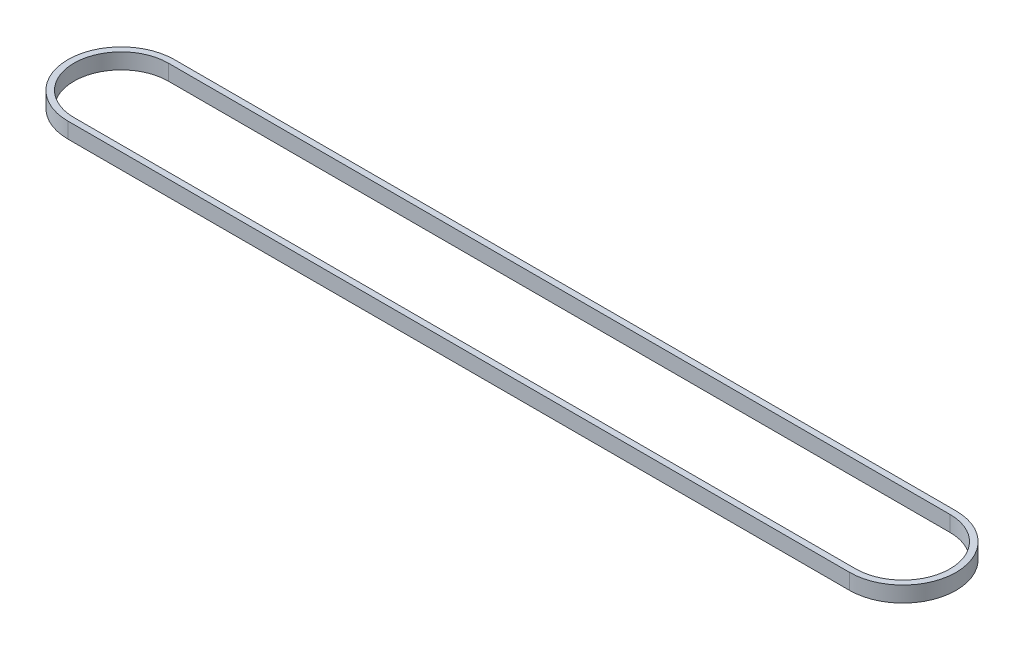
ISO-10303-21;
HEADER;
FILE_DESCRIPTION(('STEP AP214'),'2;1');
FILE_NAME('part.step','',(''),(''),'','','');
FILE_SCHEMA(('AUTOMOTIVE_DESIGN { 1 0 10303 214 1 1 1 1 }'));
ENDSEC;
DATA;
#1=APPLICATION_CONTEXT('core data for automotive mechanical design processes');
#2=APPLICATION_PROTOCOL_DEFINITION('international standard','automotive_design',2000,#1);
#3=PRODUCT_CONTEXT('',#1,'mechanical');
#4=PRODUCT('Part','Part','',(#3));
#5=PRODUCT_RELATED_PRODUCT_CATEGORY('part','',(#4));
#6=PRODUCT_DEFINITION_FORMATION('','',#4);
#7=PRODUCT_DEFINITION_CONTEXT('part definition',#1,'design');
#8=PRODUCT_DEFINITION('design','',#6,#7);
#9=PRODUCT_DEFINITION_SHAPE('','',#8);
#10=(LENGTH_UNIT() NAMED_UNIT(*) SI_UNIT(.MILLI.,.METRE.));
#11=(NAMED_UNIT(*) PLANE_ANGLE_UNIT() SI_UNIT($,.RADIAN.));
#12=(NAMED_UNIT(*) SI_UNIT($,.STERADIAN.) SOLID_ANGLE_UNIT());
#13=UNCERTAINTY_MEASURE_WITH_UNIT(LENGTH_MEASURE(1.E-05),#10,'distance_accuracy_value','');
#14=(GEOMETRIC_REPRESENTATION_CONTEXT(3) GLOBAL_UNCERTAINTY_ASSIGNED_CONTEXT((#13)) GLOBAL_UNIT_ASSIGNED_CONTEXT((#10,
#11,#12)) REPRESENTATION_CONTEXT('',''));
#15=CARTESIAN_POINT('',(0.,0.,0.));
#16=DIRECTION('',(0.,0.,1.));
#17=DIRECTION('',(1.,0.,0.));
#18=AXIS2_PLACEMENT_3D('',#15,#16,#17);
#19=CARTESIAN_POINT('',(0.,9.,-30.65));
#20=DIRECTION('',(0.,0.,-1.));
#21=DIRECTION('',(-1.,0.,0.));
#22=AXIS2_PLACEMENT_3D('',#19,#20,#21);
#23=PLANE('',#22);
#24=DIRECTION('',(1.,0.,0.));
#25=VECTOR('',#24,1.);
#26=CARTESIAN_POINT('',(0.,0.,-30.65));
#27=LINE('',#26,#25);
#28=CARTESIAN_POINT('',(0.,0.,-30.65));
#29=VERTEX_POINT('',#28);
#30=CARTESIAN_POINT('',(450.,0.,-30.65));
#31=VERTEX_POINT('',#30);
#32=EDGE_CURVE('E155',#29,#31,#27,.T.);
#33=ORIENTED_EDGE('',*,*,#32,.F.);
#34=DIRECTION('',(0.,-1.,0.));
#35=VECTOR('',#34,1.);
#36=CARTESIAN_POINT('',(0.,9.,-30.65));
#37=LINE('',#36,#35);
#38=CARTESIAN_POINT('',(0.,9.,-30.65));
#39=VERTEX_POINT('',#38);
#40=EDGE_CURVE('E11',#39,#29,#37,.T.);
#41=ORIENTED_EDGE('',*,*,#40,.F.);
#42=DIRECTION('',(1.,0.,0.));
#43=VECTOR('',#42,1.);
#44=CARTESIAN_POINT('',(0.,9.,-30.65));
#45=LINE('',#44,#43);
#46=CARTESIAN_POINT('',(450.,9.,-30.65));
#47=VERTEX_POINT('',#46);
#48=EDGE_CURVE('E128',#39,#47,#45,.T.);
#49=ORIENTED_EDGE('',*,*,#48,.T.);
#50=DIRECTION('',(0.,-1.,0.));
#51=VECTOR('',#50,1.);
#52=CARTESIAN_POINT('',(450.,9.,-30.65));
#53=LINE('',#52,#51);
#54=EDGE_CURVE('E94',#47,#31,#53,.T.);
#55=ORIENTED_EDGE('',*,*,#54,.T.);
#56=EDGE_LOOP('',(#33,#41,#49,#55));
#57=FACE_BOUND('',#56,.T.);
#58=ADVANCED_FACE('F41',(#57),#23,.T.);
#59=CARTESIAN_POINT('',(0.,9.,0.));
#60=DIRECTION('',(0.,-1.,0.));
#61=DIRECTION('',(0.,0.,-1.));
#62=AXIS2_PLACEMENT_3D('',#59,#60,#61);
#63=CYLINDRICAL_SURFACE('',#62,30.65);
#64=CARTESIAN_POINT('',(0.,0.,0.));
#65=DIRECTION('',(0.,1.,0.));
#66=DIRECTION('',(0.,0.,1.));
#67=AXIS2_PLACEMENT_3D('',#64,#65,#66);
#68=CIRCLE('',#67,30.65);
#69=CARTESIAN_POINT('',(0.,0.,30.65));
#70=VERTEX_POINT('',#69);
#71=EDGE_CURVE('E133',#29,#70,#68,.T.);
#72=ORIENTED_EDGE('',*,*,#71,.T.);
#73=DIRECTION('',(0.,-1.,0.));
#74=VECTOR('',#73,1.);
#75=CARTESIAN_POINT('',(0.,9.,30.65));
#76=LINE('',#75,#74);
#77=CARTESIAN_POINT('',(0.,9.,30.65));
#78=VERTEX_POINT('',#77);
#79=EDGE_CURVE('E51',#78,#70,#76,.T.);
#80=ORIENTED_EDGE('',*,*,#79,.F.);
#81=CARTESIAN_POINT('',(0.,9.,0.));
#82=DIRECTION('',(0.,1.,0.));
#83=DIRECTION('',(0.,0.,1.));
#84=AXIS2_PLACEMENT_3D('',#81,#82,#83);
#85=CIRCLE('',#84,30.65);
#86=EDGE_CURVE('E124',#39,#78,#85,.T.);
#87=ORIENTED_EDGE('',*,*,#86,.F.);
#88=ORIENTED_EDGE('',*,*,#40,.T.);
#89=EDGE_LOOP('',(#72,#80,#87,#88));
#90=FACE_BOUND('',#89,.T.);
#91=ADVANCED_FACE('F131',(#90),#63,.T.);
#92=CARTESIAN_POINT('',(0.,9.,30.65));
#93=DIRECTION('',(0.,0.,-1.));
#94=DIRECTION('',(-1.,0.,0.));
#95=AXIS2_PLACEMENT_3D('',#92,#93,#94);
#96=PLANE('',#95);
#97=DIRECTION('',(1.,0.,0.));
#98=VECTOR('',#97,1.);
#99=CARTESIAN_POINT('',(0.,0.,30.65));
#100=LINE('',#99,#98);
#101=CARTESIAN_POINT('',(450.,0.,30.6499999999999));
#102=VERTEX_POINT('',#101);
#103=EDGE_CURVE('E152',#70,#102,#100,.T.);
#104=ORIENTED_EDGE('',*,*,#103,.T.);
#105=DIRECTION('',(0.,-1.,0.));
#106=VECTOR('',#105,1.);
#107=CARTESIAN_POINT('',(450.,9.,30.6499999999999));
#108=LINE('',#107,#106);
#109=CARTESIAN_POINT('',(450.,9.,30.6499999999999));
#110=VERTEX_POINT('',#109);
#111=EDGE_CURVE('E123',#110,#102,#108,.T.);
#112=ORIENTED_EDGE('',*,*,#111,.F.);
#113=DIRECTION('',(1.,0.,0.));
#114=VECTOR('',#113,1.);
#115=CARTESIAN_POINT('',(0.,9.,30.65));
#116=LINE('',#115,#114);
#117=EDGE_CURVE('E117',#78,#110,#116,.T.);
#118=ORIENTED_EDGE('',*,*,#117,.F.);
#119=ORIENTED_EDGE('',*,*,#79,.T.);
#120=EDGE_LOOP('',(#104,#112,#118,#119));
#121=FACE_BOUND('',#120,.T.);
#122=ADVANCED_FACE('F120',(#121),#96,.F.);
#123=CARTESIAN_POINT('',(0.,9.,0.));
#124=DIRECTION('',(0.,-1.,0.));
#125=DIRECTION('',(0.,0.,-1.));
#126=AXIS2_PLACEMENT_3D('',#123,#124,#125);
#127=CYLINDRICAL_SURFACE('',#126,27.15);
#128=CARTESIAN_POINT('',(0.,0.,0.));
#129=DIRECTION('',(0.,1.,0.));
#130=DIRECTION('',(0.,0.,1.));
#131=AXIS2_PLACEMENT_3D('',#128,#129,#130);
#132=CIRCLE('',#131,27.15);
#133=CARTESIAN_POINT('',(0.,0.,-27.15));
#134=VERTEX_POINT('',#133);
#135=CARTESIAN_POINT('',(0.,0.,27.15));
#136=VERTEX_POINT('',#135);
#137=EDGE_CURVE('E165',#134,#136,#132,.T.);
#138=ORIENTED_EDGE('',*,*,#137,.F.);
#139=DIRECTION('',(0.,-1.,0.));
#140=VECTOR('',#139,1.);
#141=CARTESIAN_POINT('',(0.,9.,-27.15));
#142=LINE('',#141,#140);
#143=CARTESIAN_POINT('',(0.,9.,-27.15));
#144=VERTEX_POINT('',#143);
#145=EDGE_CURVE('E45',#144,#134,#142,.T.);
#146=ORIENTED_EDGE('',*,*,#145,.F.);
#147=CARTESIAN_POINT('',(0.,9.,0.));
#148=DIRECTION('',(0.,1.,0.));
#149=DIRECTION('',(0.,0.,1.));
#150=AXIS2_PLACEMENT_3D('',#147,#148,#149);
#151=CIRCLE('',#150,27.15);
#152=CARTESIAN_POINT('',(0.,9.,27.15));
#153=VERTEX_POINT('',#152);
#154=EDGE_CURVE('E151',#144,#153,#151,.T.);
#155=ORIENTED_EDGE('',*,*,#154,.T.);
#156=DIRECTION('',(0.,-1.,0.));
#157=VECTOR('',#156,1.);
#158=CARTESIAN_POINT('',(0.,9.,27.15));
#159=LINE('',#158,#157);
#160=EDGE_CURVE('E138',#153,#136,#159,.T.);
#161=ORIENTED_EDGE('',*,*,#160,.T.);
#162=EDGE_LOOP('',(#138,#146,#155,#161));
#163=FACE_BOUND('',#162,.T.);
#164=ADVANCED_FACE('F43',(#163),#127,.F.);
#165=CARTESIAN_POINT('',(0.,9.,-27.15));
#166=DIRECTION('',(0.,0.,-1.));
#167=DIRECTION('',(-1.,0.,0.));
#168=AXIS2_PLACEMENT_3D('',#165,#166,#167);
#169=PLANE('',#168);
#170=DIRECTION('',(1.,0.,0.));
#171=VECTOR('',#170,1.);
#172=CARTESIAN_POINT('',(0.,0.,-27.15));
#173=LINE('',#172,#171);
#174=CARTESIAN_POINT('',(450.,0.,-27.15));
#175=VERTEX_POINT('',#174);
#176=EDGE_CURVE('E163',#134,#175,#173,.T.);
#177=ORIENTED_EDGE('',*,*,#176,.T.);
#178=DIRECTION('',(0.,-1.,0.));
#179=VECTOR('',#178,1.);
#180=CARTESIAN_POINT('',(450.,9.,-27.15));
#181=LINE('',#180,#179);
#182=CARTESIAN_POINT('',(450.,9.,-27.15));
#183=VERTEX_POINT('',#182);
#184=EDGE_CURVE('E141',#183,#175,#181,.T.);
#185=ORIENTED_EDGE('',*,*,#184,.F.);
#186=DIRECTION('',(1.,0.,0.));
#187=VECTOR('',#186,1.);
#188=CARTESIAN_POINT('',(0.,9.,-27.15));
#189=LINE('',#188,#187);
#190=EDGE_CURVE('E175',#144,#183,#189,.T.);
#191=ORIENTED_EDGE('',*,*,#190,.F.);
#192=ORIENTED_EDGE('',*,*,#145,.T.);
#193=EDGE_LOOP('',(#177,#185,#191,#192));
#194=FACE_BOUND('',#193,.T.);
#195=ADVANCED_FACE('F186',(#194),#169,.F.);
#196=CARTESIAN_POINT('',(450.,9.,0.));
#197=DIRECTION('',(0.,-1.,0.));
#198=DIRECTION('',(0.,0.,-1.));
#199=AXIS2_PLACEMENT_3D('',#196,#197,#198);
#200=CYLINDRICAL_SURFACE('',#199,27.15);
#201=CARTESIAN_POINT('',(450.,0.,0.));
#202=DIRECTION('',(0.,1.,0.));
#203=DIRECTION('',(0.,0.,1.));
#204=AXIS2_PLACEMENT_3D('',#201,#202,#203);
#205=CIRCLE('',#204,27.15);
#206=CARTESIAN_POINT('',(450.,0.,27.1499999999999));
#207=VERTEX_POINT('',#206);
#208=EDGE_CURVE('E160',#207,#175,#205,.T.);
#209=ORIENTED_EDGE('',*,*,#208,.F.);
#210=DIRECTION('',(0.,-1.,0.));
#211=VECTOR('',#210,1.);
#212=CARTESIAN_POINT('',(450.,9.,27.1499999999999));
#213=LINE('',#212,#211);
#214=CARTESIAN_POINT('',(450.,9.,27.1499999999999));
#215=VERTEX_POINT('',#214);
#216=EDGE_CURVE('E140',#215,#207,#213,.T.);
#217=ORIENTED_EDGE('',*,*,#216,.F.);
#218=CARTESIAN_POINT('',(450.,9.,0.));
#219=DIRECTION('',(0.,1.,0.));
#220=DIRECTION('',(0.,0.,1.));
#221=AXIS2_PLACEMENT_3D('',#218,#219,#220);
#222=CIRCLE('',#221,27.15);
#223=EDGE_CURVE('E173',#215,#183,#222,.T.);
#224=ORIENTED_EDGE('',*,*,#223,.T.);
#225=ORIENTED_EDGE('',*,*,#184,.T.);
#226=EDGE_LOOP('',(#209,#217,#224,#225));
#227=FACE_BOUND('',#226,.T.);
#228=ADVANCED_FACE('F187',(#227),#200,.F.);
#229=CARTESIAN_POINT('',(0.,9.,27.15));
#230=DIRECTION('',(0.,0.,-1.));
#231=DIRECTION('',(-1.,0.,0.));
#232=AXIS2_PLACEMENT_3D('',#229,#230,#231);
#233=PLANE('',#232);
#234=DIRECTION('',(1.,0.,0.));
#235=VECTOR('',#234,1.);
#236=CARTESIAN_POINT('',(0.,0.,27.15));
#237=LINE('',#236,#235);
#238=EDGE_CURVE('E157',#136,#207,#237,.T.);
#239=ORIENTED_EDGE('',*,*,#238,.F.);
#240=ORIENTED_EDGE('',*,*,#160,.F.);
#241=DIRECTION('',(1.,0.,0.));
#242=VECTOR('',#241,1.);
#243=CARTESIAN_POINT('',(0.,9.,27.15));
#244=LINE('',#243,#242);
#245=EDGE_CURVE('E170',#153,#215,#244,.T.);
#246=ORIENTED_EDGE('',*,*,#245,.T.);
#247=ORIENTED_EDGE('',*,*,#216,.T.);
#248=EDGE_LOOP('',(#239,#240,#246,#247));
#249=FACE_BOUND('',#248,.T.);
#250=ADVANCED_FACE('F183',(#249),#233,.T.);
#251=CARTESIAN_POINT('',(450.,9.,0.));
#252=DIRECTION('',(0.,-1.,0.));
#253=DIRECTION('',(0.,0.,-1.));
#254=AXIS2_PLACEMENT_3D('',#251,#252,#253);
#255=CYLINDRICAL_SURFACE('',#254,30.65);
#256=CARTESIAN_POINT('',(450.,0.,0.));
#257=DIRECTION('',(0.,1.,0.));
#258=DIRECTION('',(0.,0.,1.));
#259=AXIS2_PLACEMENT_3D('',#256,#257,#258);
#260=CIRCLE('',#259,30.65);
#261=EDGE_CURVE('E87',#102,#31,#260,.T.);
#262=ORIENTED_EDGE('',*,*,#261,.T.);
#263=ORIENTED_EDGE('',*,*,#54,.F.);
#264=CARTESIAN_POINT('',(450.,9.,0.));
#265=DIRECTION('',(0.,1.,0.));
#266=DIRECTION('',(0.,0.,1.));
#267=AXIS2_PLACEMENT_3D('',#264,#265,#266);
#268=CIRCLE('',#267,30.65);
#269=EDGE_CURVE('E60',#110,#47,#268,.T.);
#270=ORIENTED_EDGE('',*,*,#269,.F.);
#271=ORIENTED_EDGE('',*,*,#111,.T.);
#272=EDGE_LOOP('',(#262,#263,#270,#271));
#273=FACE_BOUND('',#272,.T.);
#274=ADVANCED_FACE('F194',(#273),#255,.T.);
#275=CARTESIAN_POINT('',(0.,9.,0.));
#276=DIRECTION('',(0.,1.,0.));
#277=DIRECTION('',(0.,0.,1.));
#278=AXIS2_PLACEMENT_3D('',#275,#276,#277);
#279=PLANE('',#278);
#280=ORIENTED_EDGE('',*,*,#154,.F.);
#281=ORIENTED_EDGE('',*,*,#190,.T.);
#282=ORIENTED_EDGE('',*,*,#223,.F.);
#283=ORIENTED_EDGE('',*,*,#245,.F.);
#284=EDGE_LOOP('',(#280,#281,#282,#283));
#285=FACE_BOUND('',#284,.T.);
#286=ORIENTED_EDGE('',*,*,#48,.F.);
#287=ORIENTED_EDGE('',*,*,#86,.T.);
#288=ORIENTED_EDGE('',*,*,#117,.T.);
#289=ORIENTED_EDGE('',*,*,#269,.T.);
#290=EDGE_LOOP('',(#286,#287,#288,#289));
#291=FACE_BOUND('',#290,.T.);
#292=ADVANCED_FACE('F127',(#285,#291),#279,.T.);
#293=CARTESIAN_POINT('',(0.,0.,0.));
#294=DIRECTION('',(0.,1.,0.));
#295=DIRECTION('',(0.,0.,1.));
#296=AXIS2_PLACEMENT_3D('',#293,#294,#295);
#297=PLANE('',#296);
#298=ORIENTED_EDGE('',*,*,#137,.T.);
#299=ORIENTED_EDGE('',*,*,#238,.T.);
#300=ORIENTED_EDGE('',*,*,#208,.T.);
#301=ORIENTED_EDGE('',*,*,#176,.F.);
#302=EDGE_LOOP('',(#298,#299,#300,#301));
#303=FACE_BOUND('',#302,.T.);
#304=ORIENTED_EDGE('',*,*,#32,.T.);
#305=ORIENTED_EDGE('',*,*,#261,.F.);
#306=ORIENTED_EDGE('',*,*,#103,.F.);
#307=ORIENTED_EDGE('',*,*,#71,.F.);
#308=EDGE_LOOP('',(#304,#305,#306,#307));
#309=FACE_BOUND('',#308,.T.);
#310=ADVANCED_FACE('F185',(#303,#309),#297,.F.);
#311=CLOSED_SHELL('',(#58,#91,#122,#164,#195,#228,#250,#274,#292,#310));
#312=MANIFOLD_SOLID_BREP('B2',#311);
#313=ADVANCED_BREP_SHAPE_REPRESENTATION('',(#18,#312),#14);
#314=SHAPE_DEFINITION_REPRESENTATION(#9,#313);
ENDSEC;
END-ISO-10303-21;
